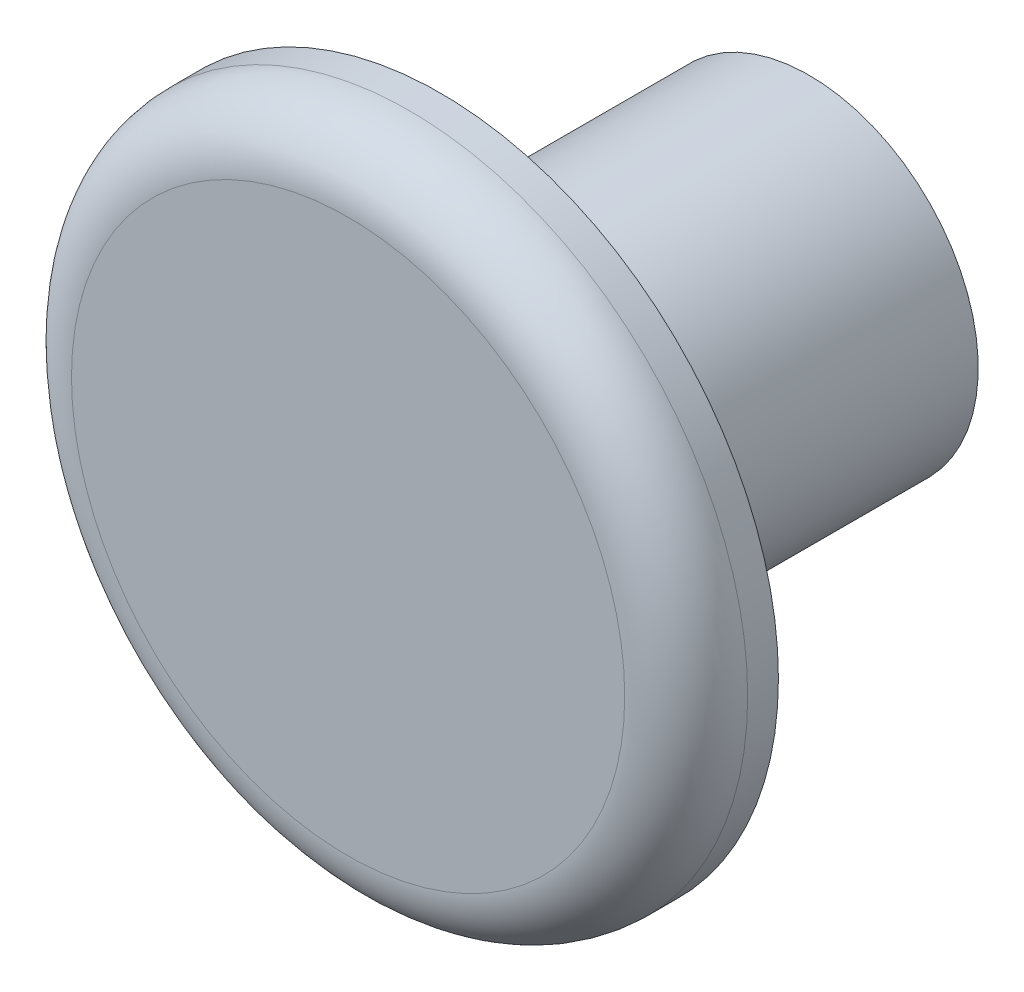
ISO-10303-21;
HEADER;
FILE_DESCRIPTION(('STEP AP214'),'2;1');
FILE_NAME('part.step','',(''),(''),'','','');
FILE_SCHEMA(('AUTOMOTIVE_DESIGN { 1 0 10303 214 1 1 1 1 }'));
ENDSEC;
DATA;
#1=APPLICATION_CONTEXT('core data for automotive mechanical design processes');
#2=APPLICATION_PROTOCOL_DEFINITION('international standard','automotive_design',2000,#1);
#3=PRODUCT_CONTEXT('',#1,'mechanical');
#4=PRODUCT('Part','Part','',(#3));
#5=PRODUCT_RELATED_PRODUCT_CATEGORY('part','',(#4));
#6=PRODUCT_DEFINITION_FORMATION('','',#4);
#7=PRODUCT_DEFINITION_CONTEXT('part definition',#1,'design');
#8=PRODUCT_DEFINITION('design','',#6,#7);
#9=PRODUCT_DEFINITION_SHAPE('','',#8);
#10=(LENGTH_UNIT() NAMED_UNIT(*) SI_UNIT(.MILLI.,.METRE.));
#11=(NAMED_UNIT(*) PLANE_ANGLE_UNIT() SI_UNIT($,.RADIAN.));
#12=(NAMED_UNIT(*) SI_UNIT($,.STERADIAN.) SOLID_ANGLE_UNIT());
#13=UNCERTAINTY_MEASURE_WITH_UNIT(LENGTH_MEASURE(1.E-05),#10,'distance_accuracy_value','');
#14=(GEOMETRIC_REPRESENTATION_CONTEXT(3) GLOBAL_UNCERTAINTY_ASSIGNED_CONTEXT((#13)) GLOBAL_UNIT_ASSIGNED_CONTEXT((#10,
#11,#12)) REPRESENTATION_CONTEXT('',''));
#15=CARTESIAN_POINT('',(0.,0.,0.));
#16=DIRECTION('',(0.,0.,1.));
#17=DIRECTION('',(1.,0.,0.));
#18=AXIS2_PLACEMENT_3D('',#15,#16,#17);
#19=CARTESIAN_POINT('',(0.,0.,-12.));
#20=DIRECTION('',(0.,0.,1.));
#21=DIRECTION('',(1.,0.,0.));
#22=AXIS2_PLACEMENT_3D('',#19,#20,#21);
#23=PLANE('',#22);
#24=CARTESIAN_POINT('',(0.,0.,-12.));
#25=DIRECTION('',(0.,0.,-1.));
#26=DIRECTION('',(-1.,0.,0.));
#27=AXIS2_PLACEMENT_3D('',#24,#25,#26);
#28=CIRCLE('',#27,5.50000000000042);
#29=CARTESIAN_POINT('',(-5.50000000000042,0.,-12.));
#30=VERTEX_POINT('',#29);
#31=EDGE_CURVE('E48',#30,#30,#28,.T.);
#32=ORIENTED_EDGE('',*,*,#31,.T.);
#33=EDGE_LOOP('',(#32));
#34=FACE_BOUND('',#33,.T.);
#35=ADVANCED_FACE('F37',(#34),#23,.F.);
#36=CARTESIAN_POINT('',(0.,0.,0.));
#37=DIRECTION('',(0.,0.,-1.));
#38=DIRECTION('',(-1.,0.,0.));
#39=AXIS2_PLACEMENT_3D('',#36,#37,#38);
#40=CYLINDRICAL_SURFACE('',#39,5.50000000000051);
#41=ORIENTED_EDGE('',*,*,#31,.F.);
#42=EDGE_LOOP('',(#41));
#43=FACE_BOUND('',#42,.T.);
#44=CARTESIAN_POINT('',(0.,0.,0.));
#45=DIRECTION('',(0.,0.,-1.));
#46=DIRECTION('',(-1.,0.,0.));
#47=AXIS2_PLACEMENT_3D('',#44,#45,#46);
#48=CIRCLE('',#47,5.5000000000006);
#49=CARTESIAN_POINT('',(-5.5000000000006,0.,0.));
#50=VERTEX_POINT('',#49);
#51=EDGE_CURVE('E52',#50,#50,#48,.T.);
#52=ORIENTED_EDGE('',*,*,#51,.T.);
#53=EDGE_LOOP('',(#52));
#54=FACE_BOUND('',#53,.T.);
#55=ADVANCED_FACE('F72',(#43,#54),#40,.T.);
#56=CARTESIAN_POINT('',(0.,-5.5000000000006,0.));
#57=DIRECTION('',(0.,0.,1.));
#58=DIRECTION('',(1.,0.,0.));
#59=AXIS2_PLACEMENT_3D('',#56,#57,#58);
#60=PLANE('',#59);
#61=ORIENTED_EDGE('',*,*,#51,.F.);
#62=EDGE_LOOP('',(#61));
#63=FACE_BOUND('',#62,.T.);
#64=CARTESIAN_POINT('',(0.,0.,0.));
#65=DIRECTION('',(0.,0.,-1.));
#66=DIRECTION('',(-1.,0.,0.));
#67=AXIS2_PLACEMENT_3D('',#64,#65,#66);
#68=CIRCLE('',#67,11.0000000000019);
#69=CARTESIAN_POINT('',(-11.0000000000019,0.,0.));
#70=VERTEX_POINT('',#69);
#71=EDGE_CURVE('E57',#70,#70,#68,.T.);
#72=ORIENTED_EDGE('',*,*,#71,.T.);
#73=EDGE_LOOP('',(#72));
#74=FACE_BOUND('',#73,.T.);
#75=ADVANCED_FACE('F61',(#63,#74),#60,.F.);
#76=CARTESIAN_POINT('',(0.,0.,0.));
#77=DIRECTION('',(0.,0.,-1.));
#78=DIRECTION('',(-1.,0.,0.));
#79=AXIS2_PLACEMENT_3D('',#76,#77,#78);
#80=CYLINDRICAL_SURFACE('',#79,11.000000000001);
#81=CARTESIAN_POINT('',(0.,0.,0.999999999999998));
#82=DIRECTION('',(0.,0.,-1.));
#83=DIRECTION('',(-1.,0.,0.));
#84=AXIS2_PLACEMENT_3D('',#81,#82,#83);
#85=CIRCLE('',#84,11.000000000001);
#86=CARTESIAN_POINT('',(-11.000000000001,0.,0.999999999999998));
#87=VERTEX_POINT('',#86);
#88=EDGE_CURVE('E44',#87,#87,#85,.T.);
#89=ORIENTED_EDGE('',*,*,#88,.T.);
#90=EDGE_LOOP('',(#89));
#91=FACE_BOUND('',#90,.T.);
#92=ORIENTED_EDGE('',*,*,#71,.F.);
#93=EDGE_LOOP('',(#92));
#94=FACE_BOUND('',#93,.T.);
#95=ADVANCED_FACE('F63',(#91,#94),#80,.T.);
#96=CARTESIAN_POINT('',(0.,-11.,3.));
#97=DIRECTION('',(0.,0.,-1.));
#98=DIRECTION('',(-1.,0.,0.));
#99=AXIS2_PLACEMENT_3D('',#96,#97,#98);
#100=PLANE('',#99);
#101=CARTESIAN_POINT('',(0.,0.,3.));
#102=DIRECTION('',(0.,0.,-1.));
#103=DIRECTION('',(-1.,0.,0.));
#104=AXIS2_PLACEMENT_3D('',#101,#102,#103);
#105=CIRCLE('',#104,9.00000000000095);
#106=CARTESIAN_POINT('',(-9.00000000000095,0.,3.));
#107=VERTEX_POINT('',#106);
#108=EDGE_CURVE('E10',#107,#107,#105,.F.);
#109=ORIENTED_EDGE('',*,*,#108,.T.);
#110=EDGE_LOOP('',(#109));
#111=FACE_BOUND('',#110,.T.);
#112=ADVANCED_FACE('F65',(#111),#100,.F.);
#113=CARTESIAN_POINT('',(0.,0.,0.999999999999998));
#114=DIRECTION('',(0.,0.,-1.));
#115=DIRECTION('',(-1.,0.,0.));
#116=AXIS2_PLACEMENT_3D('',#113,#114,#115);
#117=TOROIDAL_SURFACE('',#116,9.00000000000095,2.);
#118=ORIENTED_EDGE('',*,*,#108,.F.);
#119=EDGE_LOOP('',(#118));
#120=FACE_BOUND('',#119,.T.);
#121=ORIENTED_EDGE('',*,*,#88,.F.);
#122=EDGE_LOOP('',(#121));
#123=FACE_BOUND('',#122,.T.);
#124=ADVANCED_FACE('F39',(#120,#123),#117,.T.);
#125=CLOSED_SHELL('',(#35,#55,#75,#95,#112,#124));
#126=MANIFOLD_SOLID_BREP('B2',#125);
#127=ADVANCED_BREP_SHAPE_REPRESENTATION('',(#18,#126),#14);
#128=SHAPE_DEFINITION_REPRESENTATION(#9,#127);
ENDSEC;
END-ISO-10303-21;
